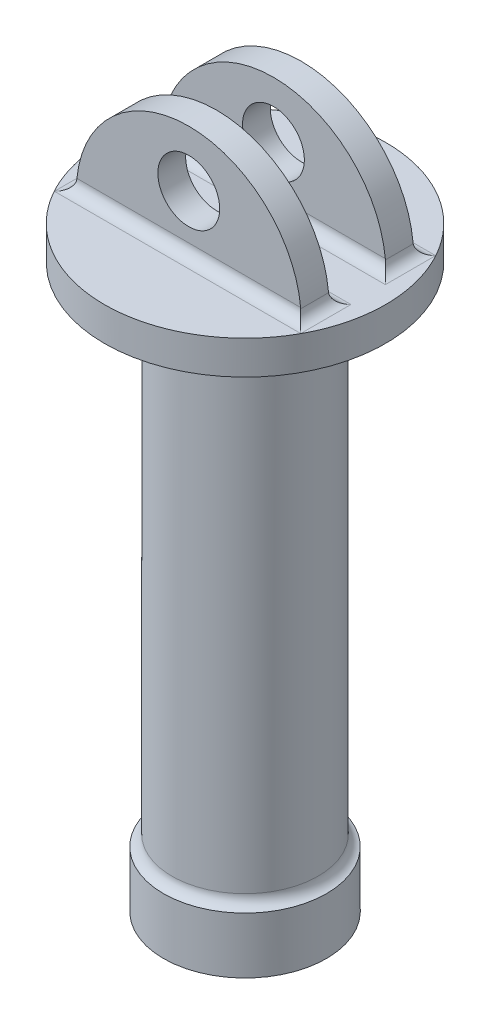
ISO-10303-21;
HEADER;
FILE_DESCRIPTION(('STEP AP214'),'2;1');
FILE_NAME('part.step','',(''),(''),'','','');
FILE_SCHEMA(('AUTOMOTIVE_DESIGN { 1 0 10303 214 1 1 1 1 }'));
ENDSEC;
DATA;
#1=APPLICATION_CONTEXT('core data for automotive mechanical design processes');
#2=APPLICATION_PROTOCOL_DEFINITION('international standard','automotive_design',2000,#1);
#3=PRODUCT_CONTEXT('',#1,'mechanical');
#4=PRODUCT('Part','Part','',(#3));
#5=PRODUCT_RELATED_PRODUCT_CATEGORY('part','',(#4));
#6=PRODUCT_DEFINITION_FORMATION('','',#4);
#7=PRODUCT_DEFINITION_CONTEXT('part definition',#1,'design');
#8=PRODUCT_DEFINITION('design','',#6,#7);
#9=PRODUCT_DEFINITION_SHAPE('','',#8);
#10=(LENGTH_UNIT() NAMED_UNIT(*) SI_UNIT(.MILLI.,.METRE.));
#11=(NAMED_UNIT(*) PLANE_ANGLE_UNIT() SI_UNIT($,.RADIAN.));
#12=(NAMED_UNIT(*) SI_UNIT($,.STERADIAN.) SOLID_ANGLE_UNIT());
#13=UNCERTAINTY_MEASURE_WITH_UNIT(LENGTH_MEASURE(1.E-05),#10,'distance_accuracy_value','');
#14=(GEOMETRIC_REPRESENTATION_CONTEXT(3) GLOBAL_UNCERTAINTY_ASSIGNED_CONTEXT((#13)) GLOBAL_UNIT_ASSIGNED_CONTEXT((#10,
#11,#12)) REPRESENTATION_CONTEXT('',''));
#15=CARTESIAN_POINT('',(0.,0.,0.));
#16=DIRECTION('',(0.,0.,1.));
#17=DIRECTION('',(1.,0.,0.));
#18=AXIS2_PLACEMENT_3D('',#15,#16,#17);
#19=CARTESIAN_POINT('',(0.,106.,10.));
#20=DIRECTION('',(0.,0.,-1.));
#21=DIRECTION('',(-1.,0.,0.));
#22=AXIS2_PLACEMENT_3D('',#19,#20,#21);
#23=CYLINDRICAL_SURFACE('',#22,20.);
#24=CARTESIAN_POINT('',(0.,106.,5.06088729539502));
#25=DIRECTION('',(0.,0.,-1.));
#26=DIRECTION('',(-1.,0.,0.));
#27=AXIS2_PLACEMENT_3D('',#24,#25,#26);
#28=CIRCLE('',#27,20.);
#29=CARTESIAN_POINT('',(-19.8997487421324,108.,5.06088729539502));
#30=VERTEX_POINT('',#29);
#31=CARTESIAN_POINT('',(19.8997487421324,108.,5.06088729539502));
#32=VERTEX_POINT('',#31);
#33=EDGE_CURVE('E274',#30,#32,#28,.T.);
#34=ORIENTED_EDGE('',*,*,#33,.F.);
#35=CARTESIAN_POINT('',(-19.8997487421324,108.,5.06088729539502));
#36=CARTESIAN_POINT('',(-19.9027989504232,107.969647945923,5.06088720940584));
#37=CARTESIAN_POINT('',(-19.9057769851641,107.939320403732,5.06019703232191));
#38=CARTESIAN_POINT('',(-19.9115887075462,107.878714343126,5.05743649596454));
#39=CARTESIAN_POINT('',(-19.9144223951874,107.84843582471,5.05536613669109));
#40=CARTESIAN_POINT('',(-19.9171839092788,107.818181818182,5.05260568632289));
#41=B_SPLINE_CURVE_WITH_KNOTS('',3,(#35,#36,#37,#38,#39,#40),.UNSPECIFIED.,.F.,.F.,(4,2,4),(0.,
0.0914436638353587,0.182887327670722),.UNSPECIFIED.);
#42=CARTESIAN_POINT('',(-19.9171839092788,107.818181818182,5.05260568632289));
#43=VERTEX_POINT('',#42);
#44=EDGE_CURVE('E276',#30,#43,#41,.T.);
#45=ORIENTED_EDGE('',*,*,#44,.T.);
#46=DIRECTION('',(0.,0.,-1.));
#47=VECTOR('',#46,1.);
#48=CARTESIAN_POINT('',(-19.9171839092788,107.818181818182,10.));
#49=LINE('',#48,#47);
#50=CARTESIAN_POINT('',(-19.9171839092788,107.818181818182,10.0082816090721));
#51=VERTEX_POINT('',#50);
#52=EDGE_CURVE('E175',#43,#51,#49,.F.);
#53=ORIENTED_EDGE('',*,*,#52,.T.);
#54=CARTESIAN_POINT('',(-19.9171839092788,107.818181818182,10.0082816090721));
#55=CARTESIAN_POINT('',(-19.9144223951874,107.84843582471,10.0055211587039));
#56=CARTESIAN_POINT('',(-19.9115887075462,107.878714343126,10.0034507994305));
#57=CARTESIAN_POINT('',(-19.9057769851641,107.939320403732,10.0006902630731));
#58=CARTESIAN_POINT('',(-19.9027989504232,107.969647945923,10.0000000859892));
#59=CARTESIAN_POINT('',(-19.8997487421324,108.,10.));
#60=B_SPLINE_CURVE_WITH_KNOTS('',3,(#54,#55,#56,#57,#58,#59),.UNSPECIFIED.,.F.,.F.,(4,2,4),(0.,
0.0914436638353635,0.182887327670723),.UNSPECIFIED.);
#61=CARTESIAN_POINT('',(-19.8997487421324,108.,10.));
#62=VERTEX_POINT('',#61);
#63=EDGE_CURVE('E11',#51,#62,#60,.T.);
#64=ORIENTED_EDGE('',*,*,#63,.T.);
#65=CARTESIAN_POINT('',(0.,106.,10.));
#66=DIRECTION('',(0.,0.,1.));
#67=DIRECTION('',(1.,0.,0.));
#68=AXIS2_PLACEMENT_3D('',#65,#66,#67);
#69=CIRCLE('',#68,20.);
#70=CARTESIAN_POINT('',(19.8997487421324,108.,10.));
#71=VERTEX_POINT('',#70);
#72=EDGE_CURVE('E323',#71,#62,#69,.T.);
#73=ORIENTED_EDGE('',*,*,#72,.F.);
#74=CARTESIAN_POINT('',(19.8997487421324,108.,10.));
#75=CARTESIAN_POINT('',(19.9027989504232,107.969647945923,10.0000000859892));
#76=CARTESIAN_POINT('',(19.9057769851641,107.939320403732,10.0006902630731));
#77=CARTESIAN_POINT('',(19.9115887075462,107.878714343126,10.0034507994305));
#78=CARTESIAN_POINT('',(19.9144223951874,107.84843582471,10.0055211587039));
#79=CARTESIAN_POINT('',(19.9171839092788,107.818181818182,10.0082816090721));
#80=B_SPLINE_CURVE_WITH_KNOTS('',3,(#74,#75,#76,#77,#78,#79),.UNSPECIFIED.,.F.,.F.,(4,2,4),(0.,
0.0914436638353587,0.182887327670722),.UNSPECIFIED.);
#81=CARTESIAN_POINT('',(19.9171839092788,107.818181818182,10.0082816090721));
#82=VERTEX_POINT('',#81);
#83=EDGE_CURVE('E46',#71,#82,#80,.T.);
#84=ORIENTED_EDGE('',*,*,#83,.T.);
#85=DIRECTION('',(0.,0.,-1.));
#86=VECTOR('',#85,1.);
#87=CARTESIAN_POINT('',(19.9171839092788,107.818181818182,10.));
#88=LINE('',#87,#86);
#89=CARTESIAN_POINT('',(19.9171839092788,107.818181818182,5.05260568632289));
#90=VERTEX_POINT('',#89);
#91=EDGE_CURVE('E54',#82,#90,#88,.T.);
#92=ORIENTED_EDGE('',*,*,#91,.T.);
#93=CARTESIAN_POINT('',(19.9171839092788,107.818181818182,5.05260568632289));
#94=CARTESIAN_POINT('',(19.9144223951874,107.84843582471,5.05536613669109));
#95=CARTESIAN_POINT('',(19.9115887075462,107.878714343126,5.05743649596454));
#96=CARTESIAN_POINT('',(19.9057769851641,107.939320403732,5.06019703232191));
#97=CARTESIAN_POINT('',(19.9027989504232,107.969647945923,5.06088720940584));
#98=CARTESIAN_POINT('',(19.8997487421324,108.,5.06088729539502));
#99=B_SPLINE_CURVE_WITH_KNOTS('',3,(#93,#94,#95,#96,#97,#98),.UNSPECIFIED.,.F.,.F.,(4,2,4),(0.,
0.0914436638353636,0.182887327670723),.UNSPECIFIED.);
#100=EDGE_CURVE('E279',#90,#32,#99,.T.);
#101=ORIENTED_EDGE('',*,*,#100,.T.);
#102=EDGE_LOOP('',(#34,#45,#53,#64,#73,#84,#92,#101));
#103=FACE_BOUND('',#102,.T.);
#104=ADVANCED_FACE('F37',(#103),#23,.T.);
#105=CARTESIAN_POINT('',(0.,106.,-10.));
#106=DIRECTION('',(0.,0.,1.));
#107=DIRECTION('',(1.,0.,0.));
#108=AXIS2_PLACEMENT_3D('',#105,#106,#107);
#109=CIRCLE('',#108,20.);
#110=CARTESIAN_POINT('',(19.8997487421324,108.,-10.));
#111=VERTEX_POINT('',#110);
#112=CARTESIAN_POINT('',(-19.8997487421324,108.,-10.));
#113=VERTEX_POINT('',#112);
#114=EDGE_CURVE('E298',#111,#113,#109,.T.);
#115=ORIENTED_EDGE('',*,*,#114,.T.);
#116=CARTESIAN_POINT('',(-19.8997487421324,108.,-10.));
#117=CARTESIAN_POINT('',(-19.9027989504232,107.969647945923,-10.0000000859892));
#118=CARTESIAN_POINT('',(-19.9057769851641,107.939320403732,-10.0006902630731));
#119=CARTESIAN_POINT('',(-19.9115887075462,107.878714343126,-10.0034507994305));
#120=CARTESIAN_POINT('',(-19.9144223951874,107.84843582471,-10.0055211587039));
#121=CARTESIAN_POINT('',(-19.9171839092788,107.818181818182,-10.0082816090721));
#122=B_SPLINE_CURVE_WITH_KNOTS('',3,(#116,#117,#118,#119,#120,#121),.UNSPECIFIED.,.F.,.F.,(4,2,
4),(0.,0.0914436638353591,0.182887327670723),.UNSPECIFIED.);
#123=CARTESIAN_POINT('',(-19.9171839092788,107.818181818182,-10.0082816090721));
#124=VERTEX_POINT('',#123);
#125=EDGE_CURVE('E204',#113,#124,#122,.T.);
#126=ORIENTED_EDGE('',*,*,#125,.T.);
#127=DIRECTION('',(0.,0.,-1.));
#128=VECTOR('',#127,1.);
#129=CARTESIAN_POINT('',(-19.9171839092788,107.818181818182,10.));
#130=LINE('',#129,#128);
#131=CARTESIAN_POINT('',(-19.9171839092788,107.818181818182,-5.0526056863229));
#132=VERTEX_POINT('',#131);
#133=EDGE_CURVE('E178',#124,#132,#130,.F.);
#134=ORIENTED_EDGE('',*,*,#133,.T.);
#135=CARTESIAN_POINT('',(-19.9171839092788,107.818181818182,-5.0526056863229));
#136=CARTESIAN_POINT('',(-19.9144223951874,107.84843582471,-5.0553661366911));
#137=CARTESIAN_POINT('',(-19.9115887075462,107.878714343126,-5.05743649596454));
#138=CARTESIAN_POINT('',(-19.9057769851641,107.939320403732,-5.06019703232191));
#139=CARTESIAN_POINT('',(-19.9027989504232,107.969647945923,-5.06088720940584));
#140=CARTESIAN_POINT('',(-19.8997487421324,108.,-5.06088729539502));
#141=B_SPLINE_CURVE_WITH_KNOTS('',3,(#135,#136,#137,#138,#139,#140),.UNSPECIFIED.,.F.,.F.,(4,2,
4),(0.,0.0914436638353636,0.182887327670723),.UNSPECIFIED.);
#142=CARTESIAN_POINT('',(-19.8997487421324,108.,-5.06088729539502));
#143=VERTEX_POINT('',#142);
#144=EDGE_CURVE('E229',#132,#143,#141,.T.);
#145=ORIENTED_EDGE('',*,*,#144,.T.);
#146=CARTESIAN_POINT('',(0.,106.,-5.06088729539502));
#147=DIRECTION('',(0.,0.,1.));
#148=DIRECTION('',(1.,0.,0.));
#149=AXIS2_PLACEMENT_3D('',#146,#147,#148);
#150=CIRCLE('',#149,20.);
#151=CARTESIAN_POINT('',(19.8997487421324,108.,-5.06088729539502));
#152=VERTEX_POINT('',#151);
#153=EDGE_CURVE('E344',#152,#143,#150,.T.);
#154=ORIENTED_EDGE('',*,*,#153,.F.);
#155=CARTESIAN_POINT('',(19.8997487421324,108.,-5.06088729539502));
#156=CARTESIAN_POINT('',(19.9027989504232,107.969647945923,-5.06088720940584));
#157=CARTESIAN_POINT('',(19.9057769851641,107.939320403732,-5.06019703232191));
#158=CARTESIAN_POINT('',(19.9115887075462,107.878714343126,-5.05743649596454));
#159=CARTESIAN_POINT('',(19.9144223951874,107.84843582471,-5.0553661366911));
#160=CARTESIAN_POINT('',(19.9171839092788,107.818181818182,-5.0526056863229));
#161=B_SPLINE_CURVE_WITH_KNOTS('',3,(#155,#156,#157,#158,#159,#160),.UNSPECIFIED.,.F.,.F.,(4,2,
4),(0.,0.0914436638353587,0.182887327670722),.UNSPECIFIED.);
#162=CARTESIAN_POINT('',(19.9171839092788,107.818181818182,-5.0526056863229));
#163=VERTEX_POINT('',#162);
#164=EDGE_CURVE('E235',#152,#163,#161,.T.);
#165=ORIENTED_EDGE('',*,*,#164,.T.);
#166=DIRECTION('',(0.,0.,-1.));
#167=VECTOR('',#166,1.);
#168=CARTESIAN_POINT('',(19.9171839092788,107.818181818182,10.));
#169=LINE('',#168,#167);
#170=CARTESIAN_POINT('',(19.9171839092788,107.818181818182,-10.0082816090721));
#171=VERTEX_POINT('',#170);
#172=EDGE_CURVE('E62',#163,#171,#169,.T.);
#173=ORIENTED_EDGE('',*,*,#172,.T.);
#174=CARTESIAN_POINT('',(19.9171839092788,107.818181818182,-10.0082816090721));
#175=CARTESIAN_POINT('',(19.9144223951874,107.84843582471,-10.0055211587039));
#176=CARTESIAN_POINT('',(19.9115887075462,107.878714343126,-10.0034507994305));
#177=CARTESIAN_POINT('',(19.9057769851641,107.939320403732,-10.0006902630731));
#178=CARTESIAN_POINT('',(19.9027989504232,107.969647945923,-10.0000000859892));
#179=CARTESIAN_POINT('',(19.8997487421324,108.,-10.));
#180=B_SPLINE_CURVE_WITH_KNOTS('',3,(#174,#175,#176,#177,#178,#179),.UNSPECIFIED.,.F.,.F.,(4,2,
4),(0.,0.0914436638353635,0.182887327670723),.UNSPECIFIED.);
#181=EDGE_CURVE('E197',#171,#111,#180,.T.);
#182=ORIENTED_EDGE('',*,*,#181,.T.);
#183=EDGE_LOOP('',(#115,#126,#134,#145,#154,#165,#173,#182));
#184=FACE_BOUND('',#183,.T.);
#185=ADVANCED_FACE('F264',(#184),#23,.T.);
#186=CARTESIAN_POINT('',(0.,116.,10.));
#187=DIRECTION('',(0.,0.,-1.));
#188=DIRECTION('',(-1.,0.,0.));
#189=AXIS2_PLACEMENT_3D('',#186,#187,#188);
#190=CYLINDRICAL_SURFACE('',#189,5.5);
#191=CARTESIAN_POINT('',(0.,116.,10.));
#192=DIRECTION('',(0.,0.,1.));
#193=DIRECTION('',(1.,0.,0.));
#194=AXIS2_PLACEMENT_3D('',#191,#192,#193);
#195=CIRCLE('',#194,5.5);
#196=CARTESIAN_POINT('',(5.5,116.,10.));
#197=VERTEX_POINT('',#196);
#198=EDGE_CURVE('E329',#197,#197,#195,.T.);
#199=ORIENTED_EDGE('',*,*,#198,.T.);
#200=EDGE_LOOP('',(#199));
#201=FACE_BOUND('',#200,.T.);
#202=CARTESIAN_POINT('',(0.,116.,5.06088729539502));
#203=DIRECTION('',(0.,0.,-1.));
#204=DIRECTION('',(-1.,0.,0.));
#205=AXIS2_PLACEMENT_3D('',#202,#203,#204);
#206=CIRCLE('',#205,5.5);
#207=CARTESIAN_POINT('',(-5.5,116.,5.06088729539502));
#208=VERTEX_POINT('',#207);
#209=EDGE_CURVE('E159',#208,#208,#206,.T.);
#210=ORIENTED_EDGE('',*,*,#209,.T.);
#211=EDGE_LOOP('',(#210));
#212=FACE_BOUND('',#211,.T.);
#213=ADVANCED_FACE('F269',(#201,#212),#190,.F.);
#214=CARTESIAN_POINT('',(0.,116.,-10.));
#215=DIRECTION('',(0.,0.,1.));
#216=DIRECTION('',(1.,0.,0.));
#217=AXIS2_PLACEMENT_3D('',#214,#215,#216);
#218=CIRCLE('',#217,5.5);
#219=CARTESIAN_POINT('',(5.5,116.,-10.));
#220=VERTEX_POINT('',#219);
#221=EDGE_CURVE('E282',#220,#220,#218,.T.);
#222=ORIENTED_EDGE('',*,*,#221,.F.);
#223=EDGE_LOOP('',(#222));
#224=FACE_BOUND('',#223,.T.);
#225=CARTESIAN_POINT('',(0.,116.,-5.06088729539502));
#226=DIRECTION('',(0.,0.,1.));
#227=DIRECTION('',(1.,0.,0.));
#228=AXIS2_PLACEMENT_3D('',#225,#226,#227);
#229=CIRCLE('',#228,5.5);
#230=CARTESIAN_POINT('',(5.5,116.,-5.06088729539502));
#231=VERTEX_POINT('',#230);
#232=EDGE_CURVE('E144',#231,#231,#229,.T.);
#233=ORIENTED_EDGE('',*,*,#232,.T.);
#234=EDGE_LOOP('',(#233));
#235=FACE_BOUND('',#234,.T.);
#236=ADVANCED_FACE('F361',(#224,#235),#190,.F.);
#237=CARTESIAN_POINT('',(0.,106.,0.));
#238=DIRECTION('',(0.,1.,0.));
#239=DIRECTION('',(0.,0.,1.));
#240=AXIS2_PLACEMENT_3D('',#237,#238,#239);
#241=PLANE('',#240);
#242=DIRECTION('',(-1.,0.,0.));
#243=VECTOR('',#242,1.);
#244=CARTESIAN_POINT('',(-20.,106.,-3.06088729539502));
#245=LINE('',#244,#243);
#246=CARTESIAN_POINT('',(21.9089023002066,106.,-3.06088729539502));
#247=VERTEX_POINT('',#246);
#248=CARTESIAN_POINT('',(-21.9089023002066,106.,-3.06088729539502));
#249=VERTEX_POINT('',#248);
#250=EDGE_CURVE('E167',#247,#249,#245,.T.);
#251=ORIENTED_EDGE('',*,*,#250,.T.);
#252=DIRECTION('',(0.,0.,-1.));
#253=VECTOR('',#252,1.);
#254=CARTESIAN_POINT('',(-21.9089023002066,106.,0.));
#255=LINE('',#254,#253);
#256=CARTESIAN_POINT('',(-21.9089023002066,106.,-12.));
#257=VERTEX_POINT('',#256);
#258=EDGE_CURVE('E171',#249,#257,#255,.T.);
#259=ORIENTED_EDGE('',*,*,#258,.T.);
#260=DIRECTION('',(1.,0.,0.));
#261=VECTOR('',#260,1.);
#262=CARTESIAN_POINT('',(0.,106.,-12.));
#263=LINE('',#262,#261);
#264=CARTESIAN_POINT('',(21.9089023002066,106.,-12.));
#265=VERTEX_POINT('',#264);
#266=EDGE_CURVE('E169',#257,#265,#263,.T.);
#267=ORIENTED_EDGE('',*,*,#266,.T.);
#268=DIRECTION('',(0.,0.,-1.));
#269=VECTOR('',#268,1.);
#270=CARTESIAN_POINT('',(21.9089023002066,106.,0.));
#271=LINE('',#270,#269);
#272=EDGE_CURVE('E165',#265,#247,#271,.F.);
#273=ORIENTED_EDGE('',*,*,#272,.T.);
#274=EDGE_LOOP('',(#251,#259,#267,#273));
#275=FACE_BOUND('',#274,.T.);
#276=DIRECTION('',(1.,0.,0.));
#277=VECTOR('',#276,1.);
#278=CARTESIAN_POINT('',(-20.,106.,12.));
#279=LINE('',#278,#277);
#280=CARTESIAN_POINT('',(21.9089023002066,106.,12.));
#281=VERTEX_POINT('',#280);
#282=CARTESIAN_POINT('',(-21.9089023002066,106.,12.));
#283=VERTEX_POINT('',#282);
#284=EDGE_CURVE('E133',#281,#283,#279,.F.);
#285=ORIENTED_EDGE('',*,*,#284,.T.);
#286=DIRECTION('',(0.,0.,-1.));
#287=VECTOR('',#286,1.);
#288=CARTESIAN_POINT('',(-21.9089023002066,106.,0.));
#289=LINE('',#288,#287);
#290=CARTESIAN_POINT('',(-21.9089023002066,106.,3.06088729539502));
#291=VERTEX_POINT('',#290);
#292=EDGE_CURVE('E163',#283,#291,#289,.T.);
#293=ORIENTED_EDGE('',*,*,#292,.T.);
#294=DIRECTION('',(1.,0.,0.));
#295=VECTOR('',#294,1.);
#296=CARTESIAN_POINT('',(20.,106.,3.06088729539502));
#297=LINE('',#296,#295);
#298=CARTESIAN_POINT('',(21.9089023002066,106.,3.06088729539502));
#299=VERTEX_POINT('',#298);
#300=EDGE_CURVE('E136',#291,#299,#297,.T.);
#301=ORIENTED_EDGE('',*,*,#300,.T.);
#302=DIRECTION('',(0.,0.,-1.));
#303=VECTOR('',#302,1.);
#304=CARTESIAN_POINT('',(21.9089023002066,106.,0.));
#305=LINE('',#304,#303);
#306=EDGE_CURVE('E128',#299,#281,#305,.F.);
#307=ORIENTED_EDGE('',*,*,#306,.T.);
#308=EDGE_LOOP('',(#285,#293,#301,#307));
#309=FACE_BOUND('',#308,.T.);
#310=CARTESIAN_POINT('',(0.,106.,0.));
#311=DIRECTION('',(0.,1.,0.));
#312=DIRECTION('',(0.,0.,1.));
#313=AXIS2_PLACEMENT_3D('',#310,#311,#312);
#314=CIRCLE('',#313,25.);
#315=CARTESIAN_POINT('',(0.,106.,25.));
#316=VERTEX_POINT('',#315);
#317=EDGE_CURVE('E327',#316,#316,#314,.T.);
#318=ORIENTED_EDGE('',*,*,#317,.T.);
#319=EDGE_LOOP('',(#318));
#320=FACE_BOUND('',#319,.T.);
#321=ADVANCED_FACE('F129',(#275,#309,#320),#241,.T.);
#322=CARTESIAN_POINT('',(0.,100.,0.));
#323=DIRECTION('',(0.,-1.,0.));
#324=DIRECTION('',(0.,0.,-1.));
#325=AXIS2_PLACEMENT_3D('',#322,#323,#324);
#326=CYLINDRICAL_SURFACE('',#325,10.);
#327=CARTESIAN_POINT('',(0.,100.,0.));
#328=DIRECTION('',(0.,1.,0.));
#329=DIRECTION('',(0.,0.,1.));
#330=AXIS2_PLACEMENT_3D('',#327,#328,#329);
#331=CIRCLE('',#330,10.);
#332=CARTESIAN_POINT('',(0.,100.,10.));
#333=VERTEX_POINT('',#332);
#334=EDGE_CURVE('E335',#333,#333,#331,.T.);
#335=ORIENTED_EDGE('',*,*,#334,.T.);
#336=EDGE_LOOP('',(#335));
#337=FACE_BOUND('',#336,.T.);
#338=CARTESIAN_POINT('',(0.,0.,0.));
#339=DIRECTION('',(0.,1.,0.));
#340=DIRECTION('',(0.,0.,1.));
#341=AXIS2_PLACEMENT_3D('',#338,#339,#340);
#342=CIRCLE('',#341,10.);
#343=CARTESIAN_POINT('',(0.,0.,10.));
#344=VERTEX_POINT('',#343);
#345=EDGE_CURVE('E153',#344,#344,#342,.T.);
#346=ORIENTED_EDGE('',*,*,#345,.F.);
#347=EDGE_LOOP('',(#346));
#348=FACE_BOUND('',#347,.T.);
#349=ADVANCED_FACE('F368',(#337,#348),#326,.F.);
#350=CARTESIAN_POINT('',(0.,100.,0.));
#351=DIRECTION('',(0.,-1.,0.));
#352=DIRECTION('',(0.,0.,-1.));
#353=AXIS2_PLACEMENT_3D('',#350,#351,#352);
#354=CYLINDRICAL_SURFACE('',#353,13.);
#355=CARTESIAN_POINT('',(0.,98.,0.));
#356=DIRECTION('',(0.,1.,0.));
#357=DIRECTION('',(0.,0.,1.));
#358=AXIS2_PLACEMENT_3D('',#355,#356,#357);
#359=CIRCLE('',#358,13.);
#360=CARTESIAN_POINT('',(0.,98.,13.));
#361=VERTEX_POINT('',#360);
#362=EDGE_CURVE('E194',#361,#361,#359,.F.);
#363=ORIENTED_EDGE('',*,*,#362,.T.);
#364=EDGE_LOOP('',(#363));
#365=FACE_BOUND('',#364,.T.);
#366=CARTESIAN_POINT('',(0.,11.9364916731037,0.));
#367=DIRECTION('',(0.,-1.,0.));
#368=DIRECTION('',(0.,0.,-1.));
#369=AXIS2_PLACEMENT_3D('',#366,#367,#368);
#370=CIRCLE('',#369,13.);
#371=CARTESIAN_POINT('',(0.,11.9364916731037,-13.));
#372=VERTEX_POINT('',#371);
#373=EDGE_CURVE('E191',#372,#372,#370,.F.);
#374=ORIENTED_EDGE('',*,*,#373,.T.);
#375=EDGE_LOOP('',(#374));
#376=FACE_BOUND('',#375,.T.);
#377=ADVANCED_FACE('F417',(#365,#376),#354,.T.);
#378=CARTESIAN_POINT('',(0.,0.,0.));
#379=DIRECTION('',(0.,1.,0.));
#380=DIRECTION('',(0.,0.,1.));
#381=AXIS2_PLACEMENT_3D('',#378,#379,#380);
#382=PLANE('',#381);
#383=ORIENTED_EDGE('',*,*,#345,.T.);
#384=EDGE_LOOP('',(#383));
#385=FACE_BOUND('',#384,.T.);
#386=CARTESIAN_POINT('',(0.,0.,0.));
#387=DIRECTION('',(0.,1.,0.));
#388=DIRECTION('',(0.,0.,1.));
#389=AXIS2_PLACEMENT_3D('',#386,#387,#388);
#390=CIRCLE('',#389,14.5);
#391=CARTESIAN_POINT('',(0.,0.,14.5));
#392=VERTEX_POINT('',#391);
#393=EDGE_CURVE('E339',#392,#392,#390,.T.);
#394=ORIENTED_EDGE('',*,*,#393,.F.);
#395=EDGE_LOOP('',(#394));
#396=FACE_BOUND('',#395,.T.);
#397=ADVANCED_FACE('F410',(#385,#396),#382,.F.);
#398=CARTESIAN_POINT('',(0.,10.,0.));
#399=DIRECTION('',(0.,-1.,0.));
#400=DIRECTION('',(0.,0.,-1.));
#401=AXIS2_PLACEMENT_3D('',#398,#399,#400);
#402=CYLINDRICAL_SURFACE('',#401,14.5);
#403=CARTESIAN_POINT('',(0.,10.,0.));
#404=DIRECTION('',(0.,1.,0.));
#405=DIRECTION('',(0.,0.,1.));
#406=AXIS2_PLACEMENT_3D('',#403,#404,#405);
#407=CIRCLE('',#406,14.5);
#408=CARTESIAN_POINT('',(0.,10.,14.5));
#409=VERTEX_POINT('',#408);
#410=EDGE_CURVE('E156',#409,#409,#407,.T.);
#411=ORIENTED_EDGE('',*,*,#410,.F.);
#412=EDGE_LOOP('',(#411));
#413=FACE_BOUND('',#412,.T.);
#414=ORIENTED_EDGE('',*,*,#393,.T.);
#415=EDGE_LOOP('',(#414));
#416=FACE_BOUND('',#415,.T.);
#417=ADVANCED_FACE('F404',(#413,#416),#402,.T.);
#418=CARTESIAN_POINT('',(0.,106.,0.));
#419=DIRECTION('',(0.,-1.,0.));
#420=DIRECTION('',(0.,0.,-1.));
#421=AXIS2_PLACEMENT_3D('',#418,#419,#420);
#422=CYLINDRICAL_SURFACE('',#421,25.);
#423=ORIENTED_EDGE('',*,*,#317,.F.);
#424=EDGE_LOOP('',(#423));
#425=FACE_BOUND('',#424,.T.);
#426=CARTESIAN_POINT('',(0.,100.,0.));
#427=DIRECTION('',(0.,1.,0.));
#428=DIRECTION('',(0.,0.,1.));
#429=AXIS2_PLACEMENT_3D('',#426,#427,#428);
#430=CIRCLE('',#429,25.);
#431=CARTESIAN_POINT('',(0.,100.,25.));
#432=VERTEX_POINT('',#431);
#433=EDGE_CURVE('E324',#432,#432,#430,.T.);
#434=ORIENTED_EDGE('',*,*,#433,.T.);
#435=EDGE_LOOP('',(#434));
#436=FACE_BOUND('',#435,.T.);
#437=ADVANCED_FACE('F399',(#425,#436),#422,.T.);
#438=CARTESIAN_POINT('',(0.,100.,0.));
#439=DIRECTION('',(0.,1.,0.));
#440=DIRECTION('',(0.,0.,1.));
#441=AXIS2_PLACEMENT_3D('',#438,#439,#440);
#442=PLANE('',#441);
#443=CARTESIAN_POINT('',(0.,100.,0.));
#444=DIRECTION('',(0.,1.,0.));
#445=DIRECTION('',(0.,0.,1.));
#446=AXIS2_PLACEMENT_3D('',#443,#444,#445);
#447=CIRCLE('',#446,15.);
#448=CARTESIAN_POINT('',(0.,100.,15.));
#449=VERTEX_POINT('',#448);
#450=EDGE_CURVE('E188',#449,#449,#447,.T.);
#451=ORIENTED_EDGE('',*,*,#450,.T.);
#452=EDGE_LOOP('',(#451));
#453=FACE_BOUND('',#452,.T.);
#454=ORIENTED_EDGE('',*,*,#433,.F.);
#455=EDGE_LOOP('',(#454));
#456=FACE_BOUND('',#455,.T.);
#457=ADVANCED_FACE('F396',(#453,#456),#442,.F.);
#458=ORIENTED_EDGE('',*,*,#334,.F.);
#459=EDGE_LOOP('',(#458));
#460=FACE_BOUND('',#459,.T.);
#461=ADVANCED_FACE('F373',(#460),#442,.F.);
#462=CARTESIAN_POINT('',(0.,106.,10.));
#463=DIRECTION('',(0.,0.,1.));
#464=DIRECTION('',(1.,0.,0.));
#465=AXIS2_PLACEMENT_3D('',#462,#463,#464);
#466=PLANE('',#465);
#467=ORIENTED_EDGE('',*,*,#72,.T.);
#468=DIRECTION('',(1.,0.,0.));
#469=VECTOR('',#468,1.);
#470=CARTESIAN_POINT('',(20.,108.,10.));
#471=LINE('',#470,#469);
#472=EDGE_CURVE('E186',#62,#71,#471,.T.);
#473=ORIENTED_EDGE('',*,*,#472,.T.);
#474=EDGE_LOOP('',(#467,#473));
#475=FACE_BOUND('',#474,.T.);
#476=ORIENTED_EDGE('',*,*,#198,.F.);
#477=EDGE_LOOP('',(#476));
#478=FACE_BOUND('',#477,.T.);
#479=ADVANCED_FACE('F321',(#475,#478),#466,.T.);
#480=CARTESIAN_POINT('',(0.,106.,-10.));
#481=DIRECTION('',(0.,0.,1.));
#482=DIRECTION('',(1.,0.,0.));
#483=AXIS2_PLACEMENT_3D('',#480,#481,#482);
#484=PLANE('',#483);
#485=ORIENTED_EDGE('',*,*,#114,.F.);
#486=DIRECTION('',(1.,0.,0.));
#487=VECTOR('',#486,1.);
#488=CARTESIAN_POINT('',(0.,108.,-10.));
#489=LINE('',#488,#487);
#490=EDGE_CURVE('E180',#111,#113,#489,.F.);
#491=ORIENTED_EDGE('',*,*,#490,.T.);
#492=EDGE_LOOP('',(#485,#491));
#493=FACE_BOUND('',#492,.T.);
#494=ORIENTED_EDGE('',*,*,#221,.T.);
#495=EDGE_LOOP('',(#494));
#496=FACE_BOUND('',#495,.T.);
#497=ADVANCED_FACE('F359',(#493,#496),#484,.F.);
#498=CARTESIAN_POINT('',(23.9705776793357,126.,5.06088729539502));
#499=DIRECTION('',(0.,0.,-1.));
#500=DIRECTION('',(-1.,0.,0.));
#501=AXIS2_PLACEMENT_3D('',#498,#499,#500);
#502=PLANE('',#501);
#503=ORIENTED_EDGE('',*,*,#209,.F.);
#504=EDGE_LOOP('',(#503));
#505=FACE_BOUND('',#504,.T.);
#506=ORIENTED_EDGE('',*,*,#33,.T.);
#507=DIRECTION('',(1.,0.,0.));
#508=VECTOR('',#507,1.);
#509=CARTESIAN_POINT('',(-20.,108.,5.06088729539502));
#510=LINE('',#509,#508);
#511=EDGE_CURVE('E182',#32,#30,#510,.F.);
#512=ORIENTED_EDGE('',*,*,#511,.T.);
#513=EDGE_LOOP('',(#506,#512));
#514=FACE_BOUND('',#513,.T.);
#515=ADVANCED_FACE('F260',(#505,#514),#502,.T.);
#516=CARTESIAN_POINT('',(23.9705776793357,126.,-5.06088729539502));
#517=DIRECTION('',(0.,0.,1.));
#518=DIRECTION('',(1.,0.,0.));
#519=AXIS2_PLACEMENT_3D('',#516,#517,#518);
#520=PLANE('',#519);
#521=ORIENTED_EDGE('',*,*,#232,.F.);
#522=EDGE_LOOP('',(#521));
#523=FACE_BOUND('',#522,.T.);
#524=ORIENTED_EDGE('',*,*,#153,.T.);
#525=DIRECTION('',(-1.,0.,0.));
#526=VECTOR('',#525,1.);
#527=CARTESIAN_POINT('',(20.,108.,-5.06088729539502));
#528=LINE('',#527,#526);
#529=EDGE_CURVE('E184',#143,#152,#528,.F.);
#530=ORIENTED_EDGE('',*,*,#529,.T.);
#531=EDGE_LOOP('',(#524,#530));
#532=FACE_BOUND('',#531,.T.);
#533=ADVANCED_FACE('F256',(#523,#532),#520,.T.);
#534=CARTESIAN_POINT('',(21.9089023002066,108.,10.));
#535=DIRECTION('',(0.,0.,-1.));
#536=DIRECTION('',(-1.,0.,0.));
#537=AXIS2_PLACEMENT_3D('',#534,#535,#536);
#538=CYLINDRICAL_SURFACE('',#537,2.);
#539=ORIENTED_EDGE('',*,*,#91,.F.);
#540=CARTESIAN_POINT('',(21.9089023002066,108.,12.));
#541=DIRECTION('',(-0.707106781186547,0.,0.707106781186547));
#542=DIRECTION('',(-0.707106781186547,0.,-0.707106781186547));
#543=AXIS2_PLACEMENT_3D('',#540,#541,#542);
#544=ELLIPSE('',#543,2.82842712474619,2.);
#545=EDGE_CURVE('E140',#281,#82,#544,.F.);
#546=ORIENTED_EDGE('',*,*,#545,.F.);
#547=ORIENTED_EDGE('',*,*,#306,.F.);
#548=CARTESIAN_POINT('',(21.9089023002066,108.,3.06088729539502));
#549=DIRECTION('',(-0.707106781186547,0.,-0.707106781186547));
#550=DIRECTION('',(0.707106781186547,0.,-0.707106781186547));
#551=AXIS2_PLACEMENT_3D('',#548,#549,#550);
#552=ELLIPSE('',#551,2.82842712474619,2.);
#553=EDGE_CURVE('E145',#90,#299,#552,.F.);
#554=ORIENTED_EDGE('',*,*,#553,.F.);
#555=EDGE_LOOP('',(#539,#546,#547,#554));
#556=FACE_BOUND('',#555,.T.);
#557=ADVANCED_FACE('F141',(#556),#538,.F.);
#558=CARTESIAN_POINT('',(0.,108.,12.));
#559=DIRECTION('',(-1.,0.,0.));
#560=DIRECTION('',(0.,0.,1.));
#561=AXIS2_PLACEMENT_3D('',#558,#559,#560);
#562=CYLINDRICAL_SURFACE('',#561,2.);
#563=ORIENTED_EDGE('',*,*,#472,.F.);
#564=ORIENTED_EDGE('',*,*,#63,.F.);
#565=CARTESIAN_POINT('',(-21.9089023002066,108.,12.));
#566=DIRECTION('',(-0.707106781186547,0.,-0.707106781186547));
#567=DIRECTION('',(-0.707106781186547,0.,0.707106781186547));
#568=AXIS2_PLACEMENT_3D('',#565,#566,#567);
#569=ELLIPSE('',#568,2.82842712474619,2.);
#570=EDGE_CURVE('E151',#283,#51,#569,.F.);
#571=ORIENTED_EDGE('',*,*,#570,.F.);
#572=ORIENTED_EDGE('',*,*,#284,.F.);
#573=ORIENTED_EDGE('',*,*,#545,.T.);
#574=ORIENTED_EDGE('',*,*,#83,.F.);
#575=EDGE_LOOP('',(#563,#564,#571,#572,#573,#574));
#576=FACE_BOUND('',#575,.T.);
#577=ADVANCED_FACE('F148',(#576),#562,.F.);
#578=CARTESIAN_POINT('',(0.,108.,3.06088729539502));
#579=DIRECTION('',(-1.,0.,0.));
#580=DIRECTION('',(0.,0.,1.));
#581=AXIS2_PLACEMENT_3D('',#578,#579,#580);
#582=CYLINDRICAL_SURFACE('',#581,2.);
#583=ORIENTED_EDGE('',*,*,#553,.T.);
#584=ORIENTED_EDGE('',*,*,#300,.F.);
#585=CARTESIAN_POINT('',(-21.9089023002066,108.,3.06088729539502));
#586=DIRECTION('',(-0.707106781186547,0.,0.707106781186547));
#587=DIRECTION('',(-0.707106781186547,0.,-0.707106781186547));
#588=AXIS2_PLACEMENT_3D('',#585,#586,#587);
#589=ELLIPSE('',#588,2.82842712474619,2.);
#590=EDGE_CURVE('E285',#43,#291,#589,.F.);
#591=ORIENTED_EDGE('',*,*,#590,.F.);
#592=ORIENTED_EDGE('',*,*,#44,.F.);
#593=ORIENTED_EDGE('',*,*,#511,.F.);
#594=ORIENTED_EDGE('',*,*,#100,.F.);
#595=EDGE_LOOP('',(#583,#584,#591,#592,#593,#594));
#596=FACE_BOUND('',#595,.T.);
#597=ADVANCED_FACE('F251',(#596),#582,.F.);
#598=CARTESIAN_POINT('',(-21.9089023002066,108.,10.));
#599=DIRECTION('',(0.,0.,-1.));
#600=DIRECTION('',(-1.,0.,0.));
#601=AXIS2_PLACEMENT_3D('',#598,#599,#600);
#602=CYLINDRICAL_SURFACE('',#601,2.);
#603=ORIENTED_EDGE('',*,*,#570,.T.);
#604=ORIENTED_EDGE('',*,*,#52,.F.);
#605=ORIENTED_EDGE('',*,*,#590,.T.);
#606=ORIENTED_EDGE('',*,*,#292,.F.);
#607=EDGE_LOOP('',(#603,#604,#605,#606));
#608=FACE_BOUND('',#607,.T.);
#609=ADVANCED_FACE('F317',(#608),#602,.F.);
#610=CARTESIAN_POINT('',(21.9089023002066,108.,10.));
#611=DIRECTION('',(0.,0.,-1.));
#612=DIRECTION('',(-1.,0.,0.));
#613=AXIS2_PLACEMENT_3D('',#610,#611,#612);
#614=CYLINDRICAL_SURFACE('',#613,2.);
#615=ORIENTED_EDGE('',*,*,#172,.F.);
#616=CARTESIAN_POINT('',(21.9089023002066,108.,-3.06088729539502));
#617=DIRECTION('',(0.707106781186547,0.,-0.707106781186547));
#618=DIRECTION('',(-0.707106781186547,0.,-0.707106781186547));
#619=AXIS2_PLACEMENT_3D('',#616,#617,#618);
#620=ELLIPSE('',#619,2.82842712474619,2.);
#621=EDGE_CURVE('E41',#247,#163,#620,.T.);
#622=ORIENTED_EDGE('',*,*,#621,.F.);
#623=ORIENTED_EDGE('',*,*,#272,.F.);
#624=CARTESIAN_POINT('',(21.9089023002066,108.,-12.));
#625=DIRECTION('',(-0.707106781186547,0.,-0.707106781186547));
#626=DIRECTION('',(0.707106781186547,0.,-0.707106781186547));
#627=AXIS2_PLACEMENT_3D('',#624,#625,#626);
#628=ELLIPSE('',#627,2.82842712474619,2.);
#629=EDGE_CURVE('E308',#171,#265,#628,.F.);
#630=ORIENTED_EDGE('',*,*,#629,.F.);
#631=EDGE_LOOP('',(#615,#622,#623,#630));
#632=FACE_BOUND('',#631,.T.);
#633=ADVANCED_FACE('F225',(#632),#614,.F.);
#634=CARTESIAN_POINT('',(0.,108.,-3.06088729539502));
#635=DIRECTION('',(1.,0.,0.));
#636=DIRECTION('',(0.,0.,-1.));
#637=AXIS2_PLACEMENT_3D('',#634,#635,#636);
#638=CYLINDRICAL_SURFACE('',#637,2.);
#639=ORIENTED_EDGE('',*,*,#529,.F.);
#640=ORIENTED_EDGE('',*,*,#144,.F.);
#641=CARTESIAN_POINT('',(-21.9089023002066,108.,-3.06088729539502));
#642=DIRECTION('',(0.707106781186547,0.,0.707106781186547));
#643=DIRECTION('',(0.707106781186547,0.,-0.707106781186547));
#644=AXIS2_PLACEMENT_3D('',#641,#642,#643);
#645=ELLIPSE('',#644,2.82842712474619,2.);
#646=EDGE_CURVE('E305',#249,#132,#645,.T.);
#647=ORIENTED_EDGE('',*,*,#646,.F.);
#648=ORIENTED_EDGE('',*,*,#250,.F.);
#649=ORIENTED_EDGE('',*,*,#621,.T.);
#650=ORIENTED_EDGE('',*,*,#164,.F.);
#651=EDGE_LOOP('',(#639,#640,#647,#648,#649,#650));
#652=FACE_BOUND('',#651,.T.);
#653=ADVANCED_FACE('F218',(#652),#638,.F.);
#654=CARTESIAN_POINT('',(0.,108.,-12.));
#655=DIRECTION('',(1.,0.,0.));
#656=DIRECTION('',(0.,0.,-1.));
#657=AXIS2_PLACEMENT_3D('',#654,#655,#656);
#658=CYLINDRICAL_SURFACE('',#657,2.);
#659=ORIENTED_EDGE('',*,*,#629,.T.);
#660=ORIENTED_EDGE('',*,*,#266,.F.);
#661=CARTESIAN_POINT('',(-21.9089023002066,108.,-12.));
#662=DIRECTION('',(0.707106781186547,0.,-0.707106781186547));
#663=DIRECTION('',(0.707106781186547,0.,0.707106781186547));
#664=AXIS2_PLACEMENT_3D('',#661,#662,#663);
#665=ELLIPSE('',#664,2.82842712474619,2.);
#666=EDGE_CURVE('E301',#124,#257,#665,.T.);
#667=ORIENTED_EDGE('',*,*,#666,.F.);
#668=ORIENTED_EDGE('',*,*,#125,.F.);
#669=ORIENTED_EDGE('',*,*,#490,.F.);
#670=ORIENTED_EDGE('',*,*,#181,.F.);
#671=EDGE_LOOP('',(#659,#660,#667,#668,#669,#670));
#672=FACE_BOUND('',#671,.T.);
#673=ADVANCED_FACE('F212',(#672),#658,.F.);
#674=CARTESIAN_POINT('',(-21.9089023002066,108.,10.));
#675=DIRECTION('',(0.,0.,-1.));
#676=DIRECTION('',(-1.,0.,0.));
#677=AXIS2_PLACEMENT_3D('',#674,#675,#676);
#678=CYLINDRICAL_SURFACE('',#677,2.);
#679=ORIENTED_EDGE('',*,*,#646,.T.);
#680=ORIENTED_EDGE('',*,*,#133,.F.);
#681=ORIENTED_EDGE('',*,*,#666,.T.);
#682=ORIENTED_EDGE('',*,*,#258,.F.);
#683=EDGE_LOOP('',(#679,#680,#681,#682));
#684=FACE_BOUND('',#683,.T.);
#685=ADVANCED_FACE('F217',(#684),#678,.F.);
#686=CARTESIAN_POINT('',(0.,98.,0.));
#687=DIRECTION('',(0.,1.,0.));
#688=DIRECTION('',(0.,0.,1.));
#689=AXIS2_PLACEMENT_3D('',#686,#687,#688);
#690=TOROIDAL_SURFACE('',#689,15.,2.);
#691=ORIENTED_EDGE('',*,*,#362,.F.);
#692=EDGE_LOOP('',(#691));
#693=FACE_BOUND('',#692,.T.);
#694=ORIENTED_EDGE('',*,*,#450,.F.);
#695=EDGE_LOOP('',(#694));
#696=FACE_BOUND('',#695,.T.);
#697=ADVANCED_FACE('F383',(#693,#696),#690,.F.);
#698=CARTESIAN_POINT('',(0.,11.9364916731037,0.));
#699=DIRECTION('',(0.,-1.,0.));
#700=DIRECTION('',(0.,0.,-1.));
#701=AXIS2_PLACEMENT_3D('',#698,#699,#700);
#702=TOROIDAL_SURFACE('',#701,15.,2.);
#703=ORIENTED_EDGE('',*,*,#410,.T.);
#704=EDGE_LOOP('',(#703));
#705=FACE_BOUND('',#704,.T.);
#706=ORIENTED_EDGE('',*,*,#373,.F.);
#707=EDGE_LOOP('',(#706));
#708=FACE_BOUND('',#707,.T.);
#709=ADVANCED_FACE('F39',(#705,#708),#702,.F.);
#710=CLOSED_SHELL('',(#104,#185,#213,#236,#321,#349,#377,#397,#417,#437,#457,#461,#479,#497,
#515,#533,#557,#577,#597,#609,#633,#653,#673,#685,#697,#709));
#711=MANIFOLD_SOLID_BREP('B2',#710);
#712=ADVANCED_BREP_SHAPE_REPRESENTATION('',(#18,#711),#14);
#713=SHAPE_DEFINITION_REPRESENTATION(#9,#712);
ENDSEC;
END-ISO-10303-21;
